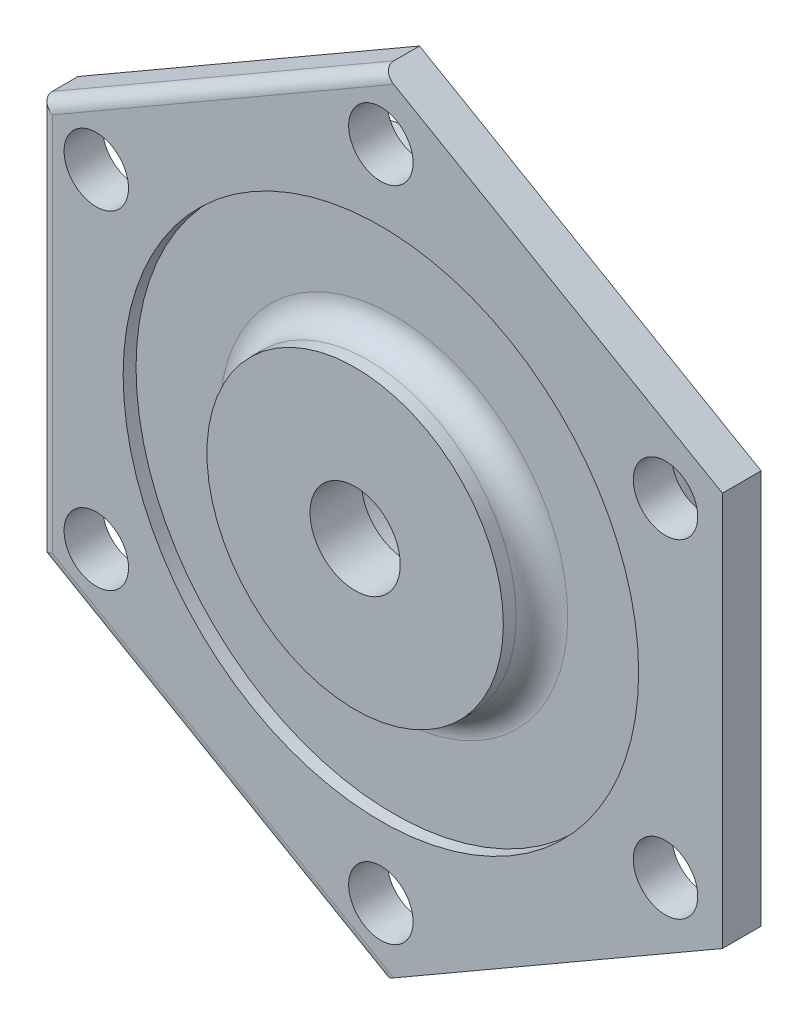
ISO-10303-21;
HEADER;
FILE_DESCRIPTION(('STEP AP214'),'2;1');
FILE_NAME('part.step','',(''),(''),'','','');
FILE_SCHEMA(('AUTOMOTIVE_DESIGN { 1 0 10303 214 1 1 1 1 }'));
ENDSEC;
DATA;
#1=APPLICATION_CONTEXT('core data for automotive mechanical design processes');
#2=APPLICATION_PROTOCOL_DEFINITION('international standard','automotive_design',2000,#1);
#3=PRODUCT_CONTEXT('',#1,'mechanical');
#4=PRODUCT('Part','Part','',(#3));
#5=PRODUCT_RELATED_PRODUCT_CATEGORY('part','',(#4));
#6=PRODUCT_DEFINITION_FORMATION('','',#4);
#7=PRODUCT_DEFINITION_CONTEXT('part definition',#1,'design');
#8=PRODUCT_DEFINITION('design','',#6,#7);
#9=PRODUCT_DEFINITION_SHAPE('','',#8);
#10=(LENGTH_UNIT() NAMED_UNIT(*) SI_UNIT(.MILLI.,.METRE.));
#11=(NAMED_UNIT(*) PLANE_ANGLE_UNIT() SI_UNIT($,.RADIAN.));
#12=(NAMED_UNIT(*) SI_UNIT($,.STERADIAN.) SOLID_ANGLE_UNIT());
#13=UNCERTAINTY_MEASURE_WITH_UNIT(LENGTH_MEASURE(1.E-05),#10,'distance_accuracy_value','');
#14=(GEOMETRIC_REPRESENTATION_CONTEXT(3) GLOBAL_UNCERTAINTY_ASSIGNED_CONTEXT((#13)) GLOBAL_UNIT_ASSIGNED_CONTEXT((#10,
#11,#12)) REPRESENTATION_CONTEXT('',''));
#15=CARTESIAN_POINT('',(0.,0.,0.));
#16=DIRECTION('',(0.,0.,1.));
#17=DIRECTION('',(1.,0.,0.));
#18=AXIS2_PLACEMENT_3D('',#15,#16,#17);
#19=CARTESIAN_POINT('',(0.,0.,-8.));
#20=DIRECTION('',(0.,0.,1.));
#21=DIRECTION('',(1.,0.,0.));
#22=AXIS2_PLACEMENT_3D('',#19,#20,#21);
#23=CYLINDRICAL_SURFACE('',#22,45.);
#24=CARTESIAN_POINT('',(0.,0.,-6.99999999999996));
#25=DIRECTION('',(0.,0.,1.));
#26=DIRECTION('',(1.,0.,0.));
#27=AXIS2_PLACEMENT_3D('',#24,#25,#26);
#28=CIRCLE('',#27,45.);
#29=CARTESIAN_POINT('',(45.,0.,-6.99999999999996));
#30=VERTEX_POINT('',#29);
#31=EDGE_CURVE('E222',#30,#30,#28,.T.);
#32=ORIENTED_EDGE('',*,*,#31,.T.);
#33=EDGE_LOOP('',(#32));
#34=FACE_BOUND('',#33,.T.);
#35=CARTESIAN_POINT('',(0.,0.,-2.));
#36=DIRECTION('',(0.,0.,1.));
#37=DIRECTION('',(1.,0.,0.));
#38=AXIS2_PLACEMENT_3D('',#35,#36,#37);
#39=CIRCLE('',#38,45.);
#40=CARTESIAN_POINT('',(45.,0.,-2.));
#41=VERTEX_POINT('',#40);
#42=EDGE_CURVE('E146',#41,#41,#39,.T.);
#43=ORIENTED_EDGE('',*,*,#42,.F.);
#44=EDGE_LOOP('',(#43));
#45=FACE_BOUND('',#44,.T.);
#46=ADVANCED_FACE('F39',(#34,#45),#23,.T.);
#47=CARTESIAN_POINT('',(0.,0.,0.));
#48=DIRECTION('',(0.,0.,1.));
#49=DIRECTION('',(1.,0.,0.));
#50=AXIS2_PLACEMENT_3D('',#47,#48,#49);
#51=PLANE('',#50);
#52=CARTESIAN_POINT('',(0.,0.,0.));
#53=DIRECTION('',(0.,0.,1.));
#54=DIRECTION('',(1.,0.,0.));
#55=AXIS2_PLACEMENT_3D('',#52,#53,#54);
#56=CIRCLE('',#55,19.);
#57=CARTESIAN_POINT('',(19.,0.,0.));
#58=VERTEX_POINT('',#57);
#59=EDGE_CURVE('E192',#58,#58,#56,.T.);
#60=ORIENTED_EDGE('',*,*,#59,.T.);
#61=EDGE_LOOP('',(#60));
#62=FACE_BOUND('',#61,.T.);
#63=CARTESIAN_POINT('',(0.,0.,0.));
#64=DIRECTION('',(0.,0.,1.));
#65=DIRECTION('',(1.,0.,0.));
#66=AXIS2_PLACEMENT_3D('',#63,#64,#65);
#67=CIRCLE('',#66,23.);
#68=CARTESIAN_POINT('',(23.,0.,0.));
#69=VERTEX_POINT('',#68);
#70=EDGE_CURVE('E203',#69,#69,#67,.T.);
#71=ORIENTED_EDGE('',*,*,#70,.F.);
#72=EDGE_LOOP('',(#71));
#73=FACE_BOUND('',#72,.T.);
#74=ADVANCED_FACE('F290',(#62,#73),#51,.F.);
#75=CARTESIAN_POINT('',(0.,0.,0.));
#76=DIRECTION('',(0.,0.,1.));
#77=DIRECTION('',(1.,0.,0.));
#78=AXIS2_PLACEMENT_3D('',#75,#76,#77);
#79=CIRCLE('',#78,7.);
#80=CARTESIAN_POINT('',(7.,0.,0.));
#81=VERTEX_POINT('',#80);
#82=EDGE_CURVE('E209',#81,#81,#79,.T.);
#83=ORIENTED_EDGE('',*,*,#82,.T.);
#84=EDGE_LOOP('',(#83));
#85=FACE_BOUND('',#84,.T.);
#86=CARTESIAN_POINT('',(0.,0.,0.));
#87=DIRECTION('',(0.,0.,1.));
#88=DIRECTION('',(1.,0.,0.));
#89=AXIS2_PLACEMENT_3D('',#86,#87,#88);
#90=CIRCLE('',#89,14.);
#91=CARTESIAN_POINT('',(14.,0.,0.));
#92=VERTEX_POINT('',#91);
#93=EDGE_CURVE('E200',#92,#92,#90,.T.);
#94=ORIENTED_EDGE('',*,*,#93,.F.);
#95=EDGE_LOOP('',(#94));
#96=FACE_BOUND('',#95,.T.);
#97=ADVANCED_FACE('F296',(#85,#96),#51,.F.);
#98=CARTESIAN_POINT('',(0.,0.,8.));
#99=DIRECTION('',(0.,0.,-1.));
#100=DIRECTION('',(-1.,0.,0.));
#101=AXIS2_PLACEMENT_3D('',#98,#99,#100);
#102=CYLINDRICAL_SURFACE('',#101,7.);
#103=CARTESIAN_POINT('',(0.,0.,8.));
#104=DIRECTION('',(0.,0.,1.));
#105=DIRECTION('',(1.,0.,0.));
#106=AXIS2_PLACEMENT_3D('',#103,#104,#105);
#107=CIRCLE('',#106,7.);
#108=CARTESIAN_POINT('',(7.,0.,8.));
#109=VERTEX_POINT('',#108);
#110=EDGE_CURVE('E204',#109,#109,#107,.T.);
#111=ORIENTED_EDGE('',*,*,#110,.T.);
#112=EDGE_LOOP('',(#111));
#113=FACE_BOUND('',#112,.T.);
#114=ORIENTED_EDGE('',*,*,#82,.F.);
#115=EDGE_LOOP('',(#114));
#116=FACE_BOUND('',#115,.T.);
#117=ADVANCED_FACE('F336',(#113,#116),#102,.F.);
#118=CARTESIAN_POINT('',(0.,0.,8.));
#119=DIRECTION('',(0.,0.,1.));
#120=DIRECTION('',(1.,0.,0.));
#121=AXIS2_PLACEMENT_3D('',#118,#119,#120);
#122=PLANE('',#121);
#123=ORIENTED_EDGE('',*,*,#110,.F.);
#124=EDGE_LOOP('',(#123));
#125=FACE_BOUND('',#124,.T.);
#126=CARTESIAN_POINT('',(0.,0.,8.));
#127=DIRECTION('',(0.,0.,1.));
#128=DIRECTION('',(1.,0.,0.));
#129=AXIS2_PLACEMENT_3D('',#126,#127,#128);
#130=CIRCLE('',#129,23.);
#131=CARTESIAN_POINT('',(23.,0.,8.));
#132=VERTEX_POINT('',#131);
#133=EDGE_CURVE('E199',#132,#132,#130,.T.);
#134=ORIENTED_EDGE('',*,*,#133,.T.);
#135=EDGE_LOOP('',(#134));
#136=FACE_BOUND('',#135,.T.);
#137=ADVANCED_FACE('F333',(#125,#136),#122,.T.);
#138=CARTESIAN_POINT('',(0.,0.,8.));
#139=DIRECTION('',(0.,0.,-1.));
#140=DIRECTION('',(-1.,0.,0.));
#141=AXIS2_PLACEMENT_3D('',#138,#139,#140);
#142=CYLINDRICAL_SURFACE('',#141,23.);
#143=CARTESIAN_POINT('',(0.,0.,6.));
#144=DIRECTION('',(0.,0.,1.));
#145=DIRECTION('',(1.,0.,0.));
#146=AXIS2_PLACEMENT_3D('',#143,#144,#145);
#147=CIRCLE('',#146,23.);
#148=CARTESIAN_POINT('',(23.,0.,6.));
#149=VERTEX_POINT('',#148);
#150=EDGE_CURVE('E216',#149,#149,#147,.T.);
#151=ORIENTED_EDGE('',*,*,#150,.T.);
#152=EDGE_LOOP('',(#151));
#153=FACE_BOUND('',#152,.T.);
#154=ORIENTED_EDGE('',*,*,#133,.F.);
#155=EDGE_LOOP('',(#154));
#156=FACE_BOUND('',#155,.T.);
#157=ADVANCED_FACE('F329',(#153,#156),#142,.T.);
#158=CARTESIAN_POINT('',(0.,0.,-8.));
#159=DIRECTION('',(0.,0.,1.));
#160=DIRECTION('',(1.,0.,0.));
#161=AXIS2_PLACEMENT_3D('',#158,#159,#160);
#162=CYLINDRICAL_SURFACE('',#161,14.);
#163=CARTESIAN_POINT('',(0.,0.,-8.));
#164=DIRECTION('',(0.,0.,1.));
#165=DIRECTION('',(1.,0.,0.));
#166=AXIS2_PLACEMENT_3D('',#163,#164,#165);
#167=CIRCLE('',#166,14.);
#168=CARTESIAN_POINT('',(14.,0.,-8.));
#169=VERTEX_POINT('',#168);
#170=EDGE_CURVE('E193',#169,#169,#167,.T.);
#171=ORIENTED_EDGE('',*,*,#170,.F.);
#172=EDGE_LOOP('',(#171));
#173=FACE_BOUND('',#172,.T.);
#174=ORIENTED_EDGE('',*,*,#93,.T.);
#175=EDGE_LOOP('',(#174));
#176=FACE_BOUND('',#175,.T.);
#177=ADVANCED_FACE('F325',(#173,#176),#162,.F.);
#178=CARTESIAN_POINT('',(0.,0.,-8.));
#179=DIRECTION('',(0.,0.,1.));
#180=DIRECTION('',(1.,0.,0.));
#181=AXIS2_PLACEMENT_3D('',#178,#179,#180);
#182=CYLINDRICAL_SURFACE('',#181,19.);
#183=CARTESIAN_POINT('',(0.,0.,-8.));
#184=DIRECTION('',(0.,0.,1.));
#185=DIRECTION('',(1.,0.,0.));
#186=AXIS2_PLACEMENT_3D('',#183,#184,#185);
#187=CIRCLE('',#186,19.);
#188=CARTESIAN_POINT('',(19.,0.,-8.));
#189=VERTEX_POINT('',#188);
#190=EDGE_CURVE('E196',#189,#189,#187,.T.);
#191=ORIENTED_EDGE('',*,*,#190,.T.);
#192=EDGE_LOOP('',(#191));
#193=FACE_BOUND('',#192,.T.);
#194=ORIENTED_EDGE('',*,*,#59,.F.);
#195=EDGE_LOOP('',(#194));
#196=FACE_BOUND('',#195,.T.);
#197=ADVANCED_FACE('F321',(#193,#196),#182,.T.);
#198=CARTESIAN_POINT('',(0.,0.,-8.));
#199=DIRECTION('',(0.,0.,1.));
#200=DIRECTION('',(1.,0.,0.));
#201=AXIS2_PLACEMENT_3D('',#198,#199,#200);
#202=PLANE('',#201);
#203=ORIENTED_EDGE('',*,*,#170,.T.);
#204=EDGE_LOOP('',(#203));
#205=FACE_BOUND('',#204,.T.);
#206=ORIENTED_EDGE('',*,*,#190,.F.);
#207=EDGE_LOOP('',(#206));
#208=FACE_BOUND('',#207,.T.);
#209=ADVANCED_FACE('F317',(#205,#208),#202,.F.);
#210=CARTESIAN_POINT('',(0.,0.,2.));
#211=DIRECTION('',(0.,0.,1.));
#212=DIRECTION('',(1.,0.,0.));
#213=AXIS2_PLACEMENT_3D('',#210,#211,#212);
#214=PLANE('',#213);
#215=CARTESIAN_POINT('',(0.,0.,2.));
#216=DIRECTION('',(0.,0.,1.));
#217=DIRECTION('',(1.,0.,0.));
#218=AXIS2_PLACEMENT_3D('',#215,#216,#217);
#219=CIRCLE('',#218,27.);
#220=CARTESIAN_POINT('',(27.,0.,2.));
#221=VERTEX_POINT('',#220);
#222=EDGE_CURVE('E219',#221,#221,#219,.F.);
#223=ORIENTED_EDGE('',*,*,#222,.T.);
#224=EDGE_LOOP('',(#223));
#225=FACE_BOUND('',#224,.T.);
#226=CARTESIAN_POINT('',(0.,0.,2.));
#227=DIRECTION('',(0.,0.,1.));
#228=DIRECTION('',(1.,0.,0.));
#229=AXIS2_PLACEMENT_3D('',#226,#227,#228);
#230=CIRCLE('',#229,40.);
#231=CARTESIAN_POINT('',(40.,0.,2.));
#232=VERTEX_POINT('',#231);
#233=EDGE_CURVE('E180',#232,#232,#230,.F.);
#234=ORIENTED_EDGE('',*,*,#233,.F.);
#235=EDGE_LOOP('',(#234));
#236=FACE_BOUND('',#235,.T.);
#237=ADVANCED_FACE('F313',(#225,#236),#214,.T.);
#238=CARTESIAN_POINT('',(0.,0.,-4.));
#239=DIRECTION('',(0.,0.,1.));
#240=DIRECTION('',(1.,0.,0.));
#241=AXIS2_PLACEMENT_3D('',#238,#239,#240);
#242=CYLINDRICAL_SURFACE('',#241,23.);
#243=CARTESIAN_POINT('',(0.,0.,-4.));
#244=DIRECTION('',(0.,0.,1.));
#245=DIRECTION('',(1.,0.,0.));
#246=AXIS2_PLACEMENT_3D('',#243,#244,#245);
#247=CIRCLE('',#246,23.);
#248=CARTESIAN_POINT('',(23.,0.,-4.));
#249=VERTEX_POINT('',#248);
#250=EDGE_CURVE('E186',#249,#249,#247,.T.);
#251=ORIENTED_EDGE('',*,*,#250,.F.);
#252=EDGE_LOOP('',(#251));
#253=FACE_BOUND('',#252,.T.);
#254=ORIENTED_EDGE('',*,*,#70,.T.);
#255=EDGE_LOOP('',(#254));
#256=FACE_BOUND('',#255,.T.);
#257=ADVANCED_FACE('F309',(#253,#256),#242,.F.);
#258=CARTESIAN_POINT('',(0.,0.,-4.));
#259=DIRECTION('',(0.,0.,1.));
#260=DIRECTION('',(1.,0.,0.));
#261=AXIS2_PLACEMENT_3D('',#258,#259,#260);
#262=PLANE('',#261);
#263=ORIENTED_EDGE('',*,*,#250,.T.);
#264=EDGE_LOOP('',(#263));
#265=FACE_BOUND('',#264,.T.);
#266=CARTESIAN_POINT('',(0.,0.,-4.));
#267=DIRECTION('',(0.,0.,1.));
#268=DIRECTION('',(1.,0.,0.));
#269=AXIS2_PLACEMENT_3D('',#266,#267,#268);
#270=CIRCLE('',#269,40.);
#271=CARTESIAN_POINT('',(40.,0.,-4.));
#272=VERTEX_POINT('',#271);
#273=EDGE_CURVE('E189',#272,#272,#270,.T.);
#274=ORIENTED_EDGE('',*,*,#273,.F.);
#275=EDGE_LOOP('',(#274));
#276=FACE_BOUND('',#275,.T.);
#277=ADVANCED_FACE('F305',(#265,#276),#262,.F.);
#278=CARTESIAN_POINT('',(0.,0.,-8.));
#279=DIRECTION('',(0.,0.,1.));
#280=DIRECTION('',(1.,0.,0.));
#281=AXIS2_PLACEMENT_3D('',#278,#279,#280);
#282=CYLINDRICAL_SURFACE('',#281,40.);
#283=CARTESIAN_POINT('',(0.,0.,-8.));
#284=DIRECTION('',(0.,0.,1.));
#285=DIRECTION('',(1.,0.,0.));
#286=AXIS2_PLACEMENT_3D('',#283,#284,#285);
#287=CIRCLE('',#286,40.);
#288=CARTESIAN_POINT('',(40.,0.,-8.));
#289=VERTEX_POINT('',#288);
#290=EDGE_CURVE('E183',#289,#289,#287,.T.);
#291=ORIENTED_EDGE('',*,*,#290,.F.);
#292=EDGE_LOOP('',(#291));
#293=FACE_BOUND('',#292,.T.);
#294=ORIENTED_EDGE('',*,*,#273,.T.);
#295=EDGE_LOOP('',(#294));
#296=FACE_BOUND('',#295,.T.);
#297=ADVANCED_FACE('F302',(#293,#296),#282,.F.);
#298=CARTESIAN_POINT('',(0.,0.,-8.));
#299=DIRECTION('',(0.,0.,1.));
#300=DIRECTION('',(1.,0.,0.));
#301=AXIS2_PLACEMENT_3D('',#298,#299,#300);
#302=PLANE('',#301);
#303=CARTESIAN_POINT('',(0.,0.,-8.));
#304=DIRECTION('',(0.,0.,1.));
#305=DIRECTION('',(1.,0.,0.));
#306=AXIS2_PLACEMENT_3D('',#303,#304,#305);
#307=CIRCLE('',#306,44.);
#308=CARTESIAN_POINT('',(44.,0.,-8.));
#309=VERTEX_POINT('',#308);
#310=EDGE_CURVE('E225',#309,#309,#307,.F.);
#311=ORIENTED_EDGE('',*,*,#310,.T.);
#312=EDGE_LOOP('',(#311));
#313=FACE_BOUND('',#312,.T.);
#314=ORIENTED_EDGE('',*,*,#290,.T.);
#315=EDGE_LOOP('',(#314));
#316=FACE_BOUND('',#315,.T.);
#317=ADVANCED_FACE('F283',(#313,#316),#302,.F.);
#318=CARTESIAN_POINT('',(0.,0.,4.));
#319=DIRECTION('',(0.,0.,-1.));
#320=DIRECTION('',(-1.,0.,0.));
#321=AXIS2_PLACEMENT_3D('',#318,#319,#320);
#322=CYLINDRICAL_SURFACE('',#321,40.);
#323=ORIENTED_EDGE('',*,*,#233,.T.);
#324=EDGE_LOOP('',(#323));
#325=FACE_BOUND('',#324,.T.);
#326=CARTESIAN_POINT('',(0.,0.,4.));
#327=DIRECTION('',(0.,0.,1.));
#328=DIRECTION('',(1.,0.,0.));
#329=AXIS2_PLACEMENT_3D('',#326,#327,#328);
#330=CIRCLE('',#329,40.);
#331=CARTESIAN_POINT('',(40.,0.,4.));
#332=VERTEX_POINT('',#331);
#333=EDGE_CURVE('E169',#332,#332,#330,.T.);
#334=ORIENTED_EDGE('',*,*,#333,.T.);
#335=EDGE_LOOP('',(#334));
#336=FACE_BOUND('',#335,.T.);
#337=ADVANCED_FACE('F274',(#325,#336),#322,.F.);
#338=CARTESIAN_POINT('',(0.,0.,4.));
#339=DIRECTION('',(0.,0.,1.));
#340=DIRECTION('',(1.,0.,0.));
#341=AXIS2_PLACEMENT_3D('',#338,#339,#340);
#342=PLANE('',#341);
#343=ORIENTED_EDGE('',*,*,#333,.F.);
#344=EDGE_LOOP('',(#343));
#345=FACE_BOUND('',#344,.T.);
#346=CARTESIAN_POINT('',(-44.1672955930064,25.5,4.));
#347=DIRECTION('',(0.,0.,1.));
#348=DIRECTION('',(1.,0.,0.));
#349=AXIS2_PLACEMENT_3D('',#346,#347,#348);
#350=CIRCLE('',#349,5.0000000000006);
#351=CARTESIAN_POINT('',(-39.1672955930058,25.5,4.));
#352=VERTEX_POINT('',#351);
#353=EDGE_CURVE('E247',#352,#352,#350,.T.);
#354=ORIENTED_EDGE('',*,*,#353,.F.);
#355=EDGE_LOOP('',(#354));
#356=FACE_BOUND('',#355,.T.);
#357=CARTESIAN_POINT('',(-44.1672955930064,-25.5,4.));
#358=DIRECTION('',(0.,0.,1.));
#359=DIRECTION('',(1.,0.,0.));
#360=AXIS2_PLACEMENT_3D('',#357,#358,#359);
#361=CIRCLE('',#360,5.00000000000047);
#362=CARTESIAN_POINT('',(-39.1672955930059,-25.5,4.));
#363=VERTEX_POINT('',#362);
#364=EDGE_CURVE('E252',#363,#363,#361,.T.);
#365=ORIENTED_EDGE('',*,*,#364,.F.);
#366=EDGE_LOOP('',(#365));
#367=FACE_BOUND('',#366,.T.);
#368=CARTESIAN_POINT('',(0.,-51.,4.));
#369=DIRECTION('',(0.,0.,1.));
#370=DIRECTION('',(1.,0.,0.));
#371=AXIS2_PLACEMENT_3D('',#368,#369,#370);
#372=CIRCLE('',#371,5.00000000000034);
#373=CARTESIAN_POINT('',(5.00000000000034,-51.,4.));
#374=VERTEX_POINT('',#373);
#375=EDGE_CURVE('E257',#374,#374,#372,.T.);
#376=ORIENTED_EDGE('',*,*,#375,.F.);
#377=EDGE_LOOP('',(#376));
#378=FACE_BOUND('',#377,.T.);
#379=CARTESIAN_POINT('',(44.1672955930064,-25.5,4.));
#380=DIRECTION('',(0.,0.,1.));
#381=DIRECTION('',(1.,0.,0.));
#382=AXIS2_PLACEMENT_3D('',#379,#380,#381);
#383=CIRCLE('',#382,5.00000000000023);
#384=CARTESIAN_POINT('',(49.1672955930066,-25.5,4.));
#385=VERTEX_POINT('',#384);
#386=EDGE_CURVE('E262',#385,#385,#383,.T.);
#387=ORIENTED_EDGE('',*,*,#386,.F.);
#388=EDGE_LOOP('',(#387));
#389=FACE_BOUND('',#388,.T.);
#390=CARTESIAN_POINT('',(44.1672955930064,25.5,4.));
#391=DIRECTION('',(0.,0.,1.));
#392=DIRECTION('',(1.,0.,0.));
#393=AXIS2_PLACEMENT_3D('',#390,#391,#392);
#394=CIRCLE('',#393,5.00000000000013);
#395=CARTESIAN_POINT('',(49.1672955930065,25.5,4.));
#396=VERTEX_POINT('',#395);
#397=EDGE_CURVE('E265',#396,#396,#394,.T.);
#398=ORIENTED_EDGE('',*,*,#397,.F.);
#399=EDGE_LOOP('',(#398));
#400=FACE_BOUND('',#399,.T.);
#401=CARTESIAN_POINT('',(0.,51.,4.));
#402=DIRECTION('',(0.,0.,1.));
#403=DIRECTION('',(1.,0.,0.));
#404=AXIS2_PLACEMENT_3D('',#401,#402,#403);
#405=CIRCLE('',#404,5.);
#406=CARTESIAN_POINT('',(5.,51.,4.));
#407=VERTEX_POINT('',#406);
#408=EDGE_CURVE('E112',#407,#407,#405,.T.);
#409=ORIENTED_EDGE('',*,*,#408,.F.);
#410=EDGE_LOOP('',(#409));
#411=FACE_BOUND('',#410,.T.);
#412=DIRECTION('',(-0.866025403784439,0.5,0.));
#413=VECTOR('',#412,1.);
#414=CARTESIAN_POINT('',(26.5,45.8993464005753,4.));
#415=LINE('',#414,#413);
#416=CARTESIAN_POINT('',(53.,30.5995642670502,4.));
#417=VERTEX_POINT('',#416);
#418=CARTESIAN_POINT('',(2.00000000000002,60.0444279957211,4.));
#419=VERTEX_POINT('',#418);
#420=EDGE_CURVE('E126',#417,#419,#415,.T.);
#421=ORIENTED_EDGE('',*,*,#420,.T.);
#422=DIRECTION('',(-0.866025403784439,-0.5,0.));
#423=VECTOR('',#422,1.);
#424=CARTESIAN_POINT('',(-25.5,44.1672955930064,4.));
#425=LINE('',#424,#423);
#426=CARTESIAN_POINT('',(-51.,29.4448637286709,4.));
#427=VERTEX_POINT('',#426);
#428=EDGE_CURVE('E231',#419,#427,#425,.T.);
#429=ORIENTED_EDGE('',*,*,#428,.T.);
#430=DIRECTION('',(0.,-1.,0.));
#431=VECTOR('',#430,1.);
#432=CARTESIAN_POINT('',(-51.,0.,4.));
#433=LINE('',#432,#431);
#434=CARTESIAN_POINT('',(-51.,-29.4448637286709,4.));
#435=VERTEX_POINT('',#434);
#436=EDGE_CURVE('E229',#427,#435,#433,.T.);
#437=ORIENTED_EDGE('',*,*,#436,.T.);
#438=DIRECTION('',(0.866025403784439,-0.5,0.));
#439=VECTOR('',#438,1.);
#440=CARTESIAN_POINT('',(-25.5,-44.1672955930064,4.));
#441=LINE('',#440,#439);
#442=CARTESIAN_POINT('',(2.,-60.0444279957211,4.));
#443=VERTEX_POINT('',#442);
#444=EDGE_CURVE('E111',#435,#443,#441,.T.);
#445=ORIENTED_EDGE('',*,*,#444,.T.);
#446=DIRECTION('',(0.866025403784438,0.5,0.));
#447=VECTOR('',#446,1.);
#448=CARTESIAN_POINT('',(26.5,-45.8993464005752,4.));
#449=LINE('',#448,#447);
#450=CARTESIAN_POINT('',(53.,-30.5995642670501,4.));
#451=VERTEX_POINT('',#450);
#452=EDGE_CURVE('E103',#443,#451,#449,.T.);
#453=ORIENTED_EDGE('',*,*,#452,.T.);
#454=DIRECTION('',(0.,1.,0.));
#455=VECTOR('',#454,1.);
#456=CARTESIAN_POINT('',(53.,0.,4.));
#457=LINE('',#456,#455);
#458=EDGE_CURVE('E108',#451,#417,#457,.T.);
#459=ORIENTED_EDGE('',*,*,#458,.T.);
#460=EDGE_LOOP('',(#421,#429,#437,#445,#453,#459));
#461=FACE_BOUND('',#460,.T.);
#462=ADVANCED_FACE('F106',(#345,#356,#367,#378,#389,#400,#411,#461),#342,.T.);
#463=CARTESIAN_POINT('',(-26.5,-45.8993464005753,-2.));
#464=DIRECTION('',(-0.5,-0.866025403784439,0.));
#465=DIRECTION('',(0.866025403784439,-0.5,0.));
#466=AXIS2_PLACEMENT_3D('',#463,#464,#465);
#467=PLANE('',#466);
#468=DIRECTION('',(0.,0.,1.));
#469=VECTOR('',#468,1.);
#470=CARTESIAN_POINT('',(0.,-61.1991285341003,-2.));
#471=LINE('',#470,#469);
#472=CARTESIAN_POINT('',(0.,-61.1991285341003,-2.));
#473=VERTEX_POINT('',#472);
#474=CARTESIAN_POINT('',(0.,-61.1991285341003,2.));
#475=VERTEX_POINT('',#474);
#476=EDGE_CURVE('E123',#473,#475,#471,.T.);
#477=ORIENTED_EDGE('',*,*,#476,.T.);
#478=DIRECTION('',(0.866025403784439,-0.5,0.));
#479=VECTOR('',#478,1.);
#480=CARTESIAN_POINT('',(-26.5,-45.8993464005753,2.));
#481=LINE('',#480,#479);
#482=CARTESIAN_POINT('',(-53.,-30.5995642670502,2.));
#483=VERTEX_POINT('',#482);
#484=EDGE_CURVE('E11',#475,#483,#481,.F.);
#485=ORIENTED_EDGE('',*,*,#484,.T.);
#486=DIRECTION('',(0.,0.,1.));
#487=VECTOR('',#486,1.);
#488=CARTESIAN_POINT('',(-53.,-30.5995642670502,-2.));
#489=LINE('',#488,#487);
#490=CARTESIAN_POINT('',(-53.,-30.5995642670502,-2.));
#491=VERTEX_POINT('',#490);
#492=EDGE_CURVE('E167',#491,#483,#489,.T.);
#493=ORIENTED_EDGE('',*,*,#492,.F.);
#494=DIRECTION('',(0.866025403784439,-0.5,0.));
#495=VECTOR('',#494,1.);
#496=CARTESIAN_POINT('',(-26.5,-45.8993464005753,-2.));
#497=LINE('',#496,#495);
#498=EDGE_CURVE('E152',#491,#473,#497,.T.);
#499=ORIENTED_EDGE('',*,*,#498,.T.);
#500=EDGE_LOOP('',(#477,#485,#493,#499));
#501=FACE_BOUND('',#500,.T.);
#502=ADVANCED_FACE('F273',(#501),#467,.T.);
#503=CARTESIAN_POINT('',(-53.,0.,-2.));
#504=DIRECTION('',(-1.,0.,0.));
#505=DIRECTION('',(0.,0.,1.));
#506=AXIS2_PLACEMENT_3D('',#503,#504,#505);
#507=PLANE('',#506);
#508=ORIENTED_EDGE('',*,*,#492,.T.);
#509=DIRECTION('',(0.,-1.,0.));
#510=VECTOR('',#509,1.);
#511=CARTESIAN_POINT('',(-53.,0.,2.));
#512=LINE('',#511,#510);
#513=CARTESIAN_POINT('',(-53.,30.5995642670502,2.));
#514=VERTEX_POINT('',#513);
#515=EDGE_CURVE('E238',#483,#514,#512,.F.);
#516=ORIENTED_EDGE('',*,*,#515,.T.);
#517=DIRECTION('',(0.,0.,1.));
#518=VECTOR('',#517,1.);
#519=CARTESIAN_POINT('',(-53.,30.5995642670502,-2.));
#520=LINE('',#519,#518);
#521=CARTESIAN_POINT('',(-53.,30.5995642670502,-2.));
#522=VERTEX_POINT('',#521);
#523=EDGE_CURVE('E170',#522,#514,#520,.T.);
#524=ORIENTED_EDGE('',*,*,#523,.F.);
#525=DIRECTION('',(0.,-1.,0.));
#526=VECTOR('',#525,1.);
#527=CARTESIAN_POINT('',(-53.,0.,-2.));
#528=LINE('',#527,#526);
#529=EDGE_CURVE('E164',#522,#491,#528,.T.);
#530=ORIENTED_EDGE('',*,*,#529,.T.);
#531=EDGE_LOOP('',(#508,#516,#524,#530));
#532=FACE_BOUND('',#531,.T.);
#533=ADVANCED_FACE('F281',(#532),#507,.T.);
#534=CARTESIAN_POINT('',(-26.5,45.8993464005752,-2.));
#535=DIRECTION('',(-0.5,0.866025403784439,0.));
#536=DIRECTION('',(-0.866025403784439,-0.5,0.));
#537=AXIS2_PLACEMENT_3D('',#534,#535,#536);
#538=PLANE('',#537);
#539=ORIENTED_EDGE('',*,*,#523,.T.);
#540=DIRECTION('',(-0.866025403784439,-0.5,0.));
#541=VECTOR('',#540,1.);
#542=CARTESIAN_POINT('',(-26.5,45.8993464005752,2.));
#543=LINE('',#542,#541);
#544=CARTESIAN_POINT('',(0.,61.1991285341003,2.));
#545=VERTEX_POINT('',#544);
#546=EDGE_CURVE('E234',#514,#545,#543,.F.);
#547=ORIENTED_EDGE('',*,*,#546,.T.);
#548=DIRECTION('',(0.,0.,1.));
#549=VECTOR('',#548,1.);
#550=CARTESIAN_POINT('',(0.,61.1991285341003,-2.));
#551=LINE('',#550,#549);
#552=CARTESIAN_POINT('',(0.,61.1991285341003,-2.));
#553=VERTEX_POINT('',#552);
#554=EDGE_CURVE('E173',#553,#545,#551,.T.);
#555=ORIENTED_EDGE('',*,*,#554,.F.);
#556=DIRECTION('',(-0.866025403784439,-0.5,0.));
#557=VECTOR('',#556,1.);
#558=CARTESIAN_POINT('',(-26.5,45.8993464005752,-2.));
#559=LINE('',#558,#557);
#560=EDGE_CURVE('E161',#553,#522,#559,.T.);
#561=ORIENTED_EDGE('',*,*,#560,.T.);
#562=EDGE_LOOP('',(#539,#547,#555,#561));
#563=FACE_BOUND('',#562,.T.);
#564=ADVANCED_FACE('F366',(#563),#538,.T.);
#565=CARTESIAN_POINT('',(26.5,45.8993464005753,-2.));
#566=DIRECTION('',(0.5,0.866025403784439,0.));
#567=DIRECTION('',(-0.866025403784439,0.5,0.));
#568=AXIS2_PLACEMENT_3D('',#565,#566,#567);
#569=PLANE('',#568);
#570=ORIENTED_EDGE('',*,*,#554,.T.);
#571=CARTESIAN_POINT('',(2.00000000000002,60.0444279957211,2.));
#572=DIRECTION('',(0.5,0.866025403784439,0.));
#573=DIRECTION('',(-0.866025403784439,0.5,0.));
#574=AXIS2_PLACEMENT_3D('',#571,#572,#573);
#575=ELLIPSE('',#574,2.3094010767585,2.);
#576=EDGE_CURVE('E236',#545,#419,#575,.T.);
#577=ORIENTED_EDGE('',*,*,#576,.T.);
#578=ORIENTED_EDGE('',*,*,#420,.F.);
#579=DIRECTION('',(0.,0.,1.));
#580=VECTOR('',#579,1.);
#581=CARTESIAN_POINT('',(53.,30.5995642670502,-2.));
#582=LINE('',#581,#580);
#583=CARTESIAN_POINT('',(53.,30.5995642670502,-2.));
#584=VERTEX_POINT('',#583);
#585=EDGE_CURVE('E122',#584,#417,#582,.T.);
#586=ORIENTED_EDGE('',*,*,#585,.F.);
#587=DIRECTION('',(-0.866025403784439,0.5,0.));
#588=VECTOR('',#587,1.);
#589=CARTESIAN_POINT('',(26.5,45.8993464005753,-2.));
#590=LINE('',#589,#588);
#591=EDGE_CURVE('E158',#584,#553,#590,.T.);
#592=ORIENTED_EDGE('',*,*,#591,.T.);
#593=EDGE_LOOP('',(#570,#577,#578,#586,#592));
#594=FACE_BOUND('',#593,.T.);
#595=ADVANCED_FACE('F371',(#594),#569,.T.);
#596=CARTESIAN_POINT('',(53.,0.,-2.));
#597=DIRECTION('',(1.,0.,0.));
#598=DIRECTION('',(0.,1.,0.));
#599=AXIS2_PLACEMENT_3D('',#596,#597,#598);
#600=PLANE('',#599);
#601=ORIENTED_EDGE('',*,*,#585,.T.);
#602=ORIENTED_EDGE('',*,*,#458,.F.);
#603=DIRECTION('',(0.,0.,1.));
#604=VECTOR('',#603,1.);
#605=CARTESIAN_POINT('',(53.,-30.5995642670501,-2.));
#606=LINE('',#605,#604);
#607=CARTESIAN_POINT('',(53.,-30.5995642670501,-2.));
#608=VERTEX_POINT('',#607);
#609=EDGE_CURVE('E115',#608,#451,#606,.T.);
#610=ORIENTED_EDGE('',*,*,#609,.F.);
#611=DIRECTION('',(0.,1.,0.));
#612=VECTOR('',#611,1.);
#613=CARTESIAN_POINT('',(53.,0.,-2.));
#614=LINE('',#613,#612);
#615=EDGE_CURVE('E156',#608,#584,#614,.T.);
#616=ORIENTED_EDGE('',*,*,#615,.T.);
#617=EDGE_LOOP('',(#601,#602,#610,#616));
#618=FACE_BOUND('',#617,.T.);
#619=ADVANCED_FACE('F125',(#618),#600,.T.);
#620=CARTESIAN_POINT('',(0.,51.,-2.));
#621=DIRECTION('',(0.,0.,1.));
#622=DIRECTION('',(1.,0.,0.));
#623=AXIS2_PLACEMENT_3D('',#620,#621,#622);
#624=CYLINDRICAL_SURFACE('',#623,5.);
#625=CARTESIAN_POINT('',(0.,51.,-2.));
#626=DIRECTION('',(0.,0.,1.));
#627=DIRECTION('',(1.,0.,0.));
#628=AXIS2_PLACEMENT_3D('',#625,#626,#627);
#629=CIRCLE('',#628,5.);
#630=CARTESIAN_POINT('',(5.,51.,-2.));
#631=VERTEX_POINT('',#630);
#632=EDGE_CURVE('E149',#631,#631,#629,.T.);
#633=ORIENTED_EDGE('',*,*,#632,.F.);
#634=EDGE_LOOP('',(#633));
#635=FACE_BOUND('',#634,.T.);
#636=ORIENTED_EDGE('',*,*,#408,.T.);
#637=EDGE_LOOP('',(#636));
#638=FACE_BOUND('',#637,.T.);
#639=ADVANCED_FACE('F270',(#635,#638),#624,.F.);
#640=CARTESIAN_POINT('',(44.1672955930064,25.5,-2.));
#641=DIRECTION('',(0.,0.,1.));
#642=DIRECTION('',(1.,0.,0.));
#643=AXIS2_PLACEMENT_3D('',#640,#641,#642);
#644=CYLINDRICAL_SURFACE('',#643,5.00000000000013);
#645=CARTESIAN_POINT('',(44.1672955930064,25.5,-2.));
#646=DIRECTION('',(0.,0.,1.));
#647=DIRECTION('',(1.,0.,0.));
#648=AXIS2_PLACEMENT_3D('',#645,#646,#647);
#649=CIRCLE('',#648,5.00000000000013);
#650=CARTESIAN_POINT('',(49.1672955930065,25.5,-2.));
#651=VERTEX_POINT('',#650);
#652=EDGE_CURVE('E143',#651,#651,#649,.T.);
#653=ORIENTED_EDGE('',*,*,#652,.F.);
#654=EDGE_LOOP('',(#653));
#655=FACE_BOUND('',#654,.T.);
#656=ORIENTED_EDGE('',*,*,#397,.T.);
#657=EDGE_LOOP('',(#656));
#658=FACE_BOUND('',#657,.T.);
#659=ADVANCED_FACE('F395',(#655,#658),#644,.F.);
#660=CARTESIAN_POINT('',(44.1672955930064,-25.5,-2.));
#661=DIRECTION('',(0.,0.,1.));
#662=DIRECTION('',(1.,0.,0.));
#663=AXIS2_PLACEMENT_3D('',#660,#661,#662);
#664=CYLINDRICAL_SURFACE('',#663,5.00000000000023);
#665=CARTESIAN_POINT('',(44.1672955930064,-25.5,-2.));
#666=DIRECTION('',(0.,0.,1.));
#667=DIRECTION('',(1.,0.,0.));
#668=AXIS2_PLACEMENT_3D('',#665,#666,#667);
#669=CIRCLE('',#668,5.00000000000023);
#670=CARTESIAN_POINT('',(49.1672955930066,-25.5,-2.));
#671=VERTEX_POINT('',#670);
#672=EDGE_CURVE('E140',#671,#671,#669,.T.);
#673=ORIENTED_EDGE('',*,*,#672,.F.);
#674=EDGE_LOOP('',(#673));
#675=FACE_BOUND('',#674,.T.);
#676=ORIENTED_EDGE('',*,*,#386,.T.);
#677=EDGE_LOOP('',(#676));
#678=FACE_BOUND('',#677,.T.);
#679=ADVANCED_FACE('F399',(#675,#678),#664,.F.);
#680=CARTESIAN_POINT('',(0.,-51.,-2.));
#681=DIRECTION('',(0.,0.,1.));
#682=DIRECTION('',(1.,0.,0.));
#683=AXIS2_PLACEMENT_3D('',#680,#681,#682);
#684=CYLINDRICAL_SURFACE('',#683,5.00000000000034);
#685=CARTESIAN_POINT('',(0.,-51.,-2.));
#686=DIRECTION('',(0.,0.,1.));
#687=DIRECTION('',(1.,0.,0.));
#688=AXIS2_PLACEMENT_3D('',#685,#686,#687);
#689=CIRCLE('',#688,5.00000000000034);
#690=CARTESIAN_POINT('',(5.00000000000034,-51.,-2.));
#691=VERTEX_POINT('',#690);
#692=EDGE_CURVE('E137',#691,#691,#689,.T.);
#693=ORIENTED_EDGE('',*,*,#692,.F.);
#694=EDGE_LOOP('',(#693));
#695=FACE_BOUND('',#694,.T.);
#696=ORIENTED_EDGE('',*,*,#375,.T.);
#697=EDGE_LOOP('',(#696));
#698=FACE_BOUND('',#697,.T.);
#699=ADVANCED_FACE('F403',(#695,#698),#684,.F.);
#700=CARTESIAN_POINT('',(-44.1672955930064,-25.5,-2.));
#701=DIRECTION('',(0.,0.,1.));
#702=DIRECTION('',(1.,0.,0.));
#703=AXIS2_PLACEMENT_3D('',#700,#701,#702);
#704=CYLINDRICAL_SURFACE('',#703,5.00000000000047);
#705=CARTESIAN_POINT('',(-44.1672955930064,-25.5,-2.));
#706=DIRECTION('',(0.,0.,1.));
#707=DIRECTION('',(1.,0.,0.));
#708=AXIS2_PLACEMENT_3D('',#705,#706,#707);
#709=CIRCLE('',#708,5.00000000000047);
#710=CARTESIAN_POINT('',(-39.1672955930059,-25.5,-2.));
#711=VERTEX_POINT('',#710);
#712=EDGE_CURVE('E134',#711,#711,#709,.T.);
#713=ORIENTED_EDGE('',*,*,#712,.F.);
#714=EDGE_LOOP('',(#713));
#715=FACE_BOUND('',#714,.T.);
#716=ORIENTED_EDGE('',*,*,#364,.T.);
#717=EDGE_LOOP('',(#716));
#718=FACE_BOUND('',#717,.T.);
#719=ADVANCED_FACE('F407',(#715,#718),#704,.F.);
#720=CARTESIAN_POINT('',(-44.1672955930064,25.5,-2.));
#721=DIRECTION('',(0.,0.,1.));
#722=DIRECTION('',(1.,0.,0.));
#723=AXIS2_PLACEMENT_3D('',#720,#721,#722);
#724=CYLINDRICAL_SURFACE('',#723,5.0000000000006);
#725=CARTESIAN_POINT('',(-44.1672955930064,25.5,-2.));
#726=DIRECTION('',(0.,0.,1.));
#727=DIRECTION('',(1.,0.,0.));
#728=AXIS2_PLACEMENT_3D('',#725,#726,#727);
#729=CIRCLE('',#728,5.0000000000006);
#730=CARTESIAN_POINT('',(-39.1672955930058,25.5,-2.));
#731=VERTEX_POINT('',#730);
#732=EDGE_CURVE('E128',#731,#731,#729,.T.);
#733=ORIENTED_EDGE('',*,*,#732,.F.);
#734=EDGE_LOOP('',(#733));
#735=FACE_BOUND('',#734,.T.);
#736=ORIENTED_EDGE('',*,*,#353,.T.);
#737=EDGE_LOOP('',(#736));
#738=FACE_BOUND('',#737,.T.);
#739=ADVANCED_FACE('F381',(#735,#738),#724,.F.);
#740=CARTESIAN_POINT('',(26.5,-45.8993464005752,-2.));
#741=DIRECTION('',(0.5,-0.866025403784438,0.));
#742=DIRECTION('',(0.866025403784438,0.5,0.));
#743=AXIS2_PLACEMENT_3D('',#740,#741,#742);
#744=PLANE('',#743);
#745=ORIENTED_EDGE('',*,*,#452,.F.);
#746=CARTESIAN_POINT('',(2.00000000000001,-60.0444279957211,2.));
#747=DIRECTION('',(0.5,-0.866025403784438,0.));
#748=DIRECTION('',(0.866025403784438,0.5,0.));
#749=AXIS2_PLACEMENT_3D('',#746,#747,#748);
#750=ELLIPSE('',#749,2.3094010767585,2.);
#751=EDGE_CURVE('E48',#443,#475,#750,.T.);
#752=ORIENTED_EDGE('',*,*,#751,.T.);
#753=ORIENTED_EDGE('',*,*,#476,.F.);
#754=DIRECTION('',(0.866025403784438,0.5,0.));
#755=VECTOR('',#754,1.);
#756=CARTESIAN_POINT('',(26.5,-45.8993464005752,-2.));
#757=LINE('',#756,#755);
#758=EDGE_CURVE('E118',#473,#608,#757,.T.);
#759=ORIENTED_EDGE('',*,*,#758,.T.);
#760=ORIENTED_EDGE('',*,*,#609,.T.);
#761=EDGE_LOOP('',(#745,#752,#753,#759,#760));
#762=FACE_BOUND('',#761,.T.);
#763=ADVANCED_FACE('F116',(#762),#744,.T.);
#764=CARTESIAN_POINT('',(0.,0.,-2.));
#765=DIRECTION('',(0.,0.,1.));
#766=DIRECTION('',(1.,0.,0.));
#767=AXIS2_PLACEMENT_3D('',#764,#765,#766);
#768=PLANE('',#767);
#769=ORIENTED_EDGE('',*,*,#732,.T.);
#770=EDGE_LOOP('',(#769));
#771=FACE_BOUND('',#770,.T.);
#772=ORIENTED_EDGE('',*,*,#712,.T.);
#773=EDGE_LOOP('',(#772));
#774=FACE_BOUND('',#773,.T.);
#775=ORIENTED_EDGE('',*,*,#692,.T.);
#776=EDGE_LOOP('',(#775));
#777=FACE_BOUND('',#776,.T.);
#778=ORIENTED_EDGE('',*,*,#672,.T.);
#779=EDGE_LOOP('',(#778));
#780=FACE_BOUND('',#779,.T.);
#781=ORIENTED_EDGE('',*,*,#652,.T.);
#782=EDGE_LOOP('',(#781));
#783=FACE_BOUND('',#782,.T.);
#784=ORIENTED_EDGE('',*,*,#42,.T.);
#785=EDGE_LOOP('',(#784));
#786=FACE_BOUND('',#785,.T.);
#787=ORIENTED_EDGE('',*,*,#632,.T.);
#788=EDGE_LOOP('',(#787));
#789=FACE_BOUND('',#788,.T.);
#790=ORIENTED_EDGE('',*,*,#498,.F.);
#791=ORIENTED_EDGE('',*,*,#529,.F.);
#792=ORIENTED_EDGE('',*,*,#560,.F.);
#793=ORIENTED_EDGE('',*,*,#591,.F.);
#794=ORIENTED_EDGE('',*,*,#615,.F.);
#795=ORIENTED_EDGE('',*,*,#758,.F.);
#796=EDGE_LOOP('',(#790,#791,#792,#793,#794,#795));
#797=FACE_BOUND('',#796,.T.);
#798=ADVANCED_FACE('F346',(#771,#774,#777,#780,#783,#786,#789,#797),#768,.F.);
#799=CARTESIAN_POINT('',(0.,0.,6.));
#800=DIRECTION('',(0.,0.,1.));
#801=DIRECTION('',(1.,0.,0.));
#802=AXIS2_PLACEMENT_3D('',#799,#800,#801);
#803=TOROIDAL_SURFACE('',#802,27.,4.);
#804=ORIENTED_EDGE('',*,*,#222,.F.);
#805=EDGE_LOOP('',(#804));
#806=FACE_BOUND('',#805,.T.);
#807=ORIENTED_EDGE('',*,*,#150,.F.);
#808=EDGE_LOOP('',(#807));
#809=FACE_BOUND('',#808,.T.);
#810=ADVANCED_FACE('F342',(#806,#809),#803,.F.);
#811=CARTESIAN_POINT('',(0.,0.,-6.99999999999996));
#812=DIRECTION('',(0.,0.,1.));
#813=DIRECTION('',(1.,0.,0.));
#814=AXIS2_PLACEMENT_3D('',#811,#812,#813);
#815=CONICAL_SURFACE('',#814,45.,0.785398163397455);
#816=ORIENTED_EDGE('',*,*,#310,.F.);
#817=EDGE_LOOP('',(#816));
#818=FACE_BOUND('',#817,.T.);
#819=ORIENTED_EDGE('',*,*,#31,.F.);
#820=EDGE_LOOP('',(#819));
#821=FACE_BOUND('',#820,.T.);
#822=ADVANCED_FACE('F345',(#818,#821),#815,.T.);
#823=CARTESIAN_POINT('',(-25.5,-44.1672955930064,2.));
#824=DIRECTION('',(0.866025403784439,-0.5,0.));
#825=DIRECTION('',(0.5,0.866025403784439,0.));
#826=AXIS2_PLACEMENT_3D('',#823,#824,#825);
#827=CYLINDRICAL_SURFACE('',#826,2.);
#828=ORIENTED_EDGE('',*,*,#751,.F.);
#829=ORIENTED_EDGE('',*,*,#444,.F.);
#830=CARTESIAN_POINT('',(-51.,-29.4448637286709,2.));
#831=DIRECTION('',(0.5,-0.866025403784439,0.));
#832=DIRECTION('',(0.866025403784439,0.5,0.));
#833=AXIS2_PLACEMENT_3D('',#830,#831,#832);
#834=ELLIPSE('',#833,2.3094010767585,2.);
#835=EDGE_CURVE('E43',#483,#435,#834,.F.);
#836=ORIENTED_EDGE('',*,*,#835,.F.);
#837=ORIENTED_EDGE('',*,*,#484,.F.);
#838=EDGE_LOOP('',(#828,#829,#836,#837));
#839=FACE_BOUND('',#838,.T.);
#840=ADVANCED_FACE('F41',(#839),#827,.T.);
#841=CARTESIAN_POINT('',(-51.,0.,2.));
#842=DIRECTION('',(0.,-1.,0.));
#843=DIRECTION('',(0.,0.,-1.));
#844=AXIS2_PLACEMENT_3D('',#841,#842,#843);
#845=CYLINDRICAL_SURFACE('',#844,2.);
#846=ORIENTED_EDGE('',*,*,#835,.T.);
#847=ORIENTED_EDGE('',*,*,#436,.F.);
#848=CARTESIAN_POINT('',(-51.,29.4448637286709,2.));
#849=DIRECTION('',(-0.5,-0.866025403784439,0.));
#850=DIRECTION('',(0.866025403784439,-0.5,0.));
#851=AXIS2_PLACEMENT_3D('',#848,#849,#850);
#852=ELLIPSE('',#851,2.3094010767585,2.);
#853=EDGE_CURVE('E240',#514,#427,#852,.F.);
#854=ORIENTED_EDGE('',*,*,#853,.F.);
#855=ORIENTED_EDGE('',*,*,#515,.F.);
#856=EDGE_LOOP('',(#846,#847,#854,#855));
#857=FACE_BOUND('',#856,.T.);
#858=ADVANCED_FACE('F356',(#857),#845,.T.);
#859=CARTESIAN_POINT('',(-25.5,44.1672955930064,2.));
#860=DIRECTION('',(-0.866025403784439,-0.5,0.));
#861=DIRECTION('',(0.5,-0.866025403784439,0.));
#862=AXIS2_PLACEMENT_3D('',#859,#860,#861);
#863=CYLINDRICAL_SURFACE('',#862,2.);
#864=ORIENTED_EDGE('',*,*,#576,.F.);
#865=ORIENTED_EDGE('',*,*,#546,.F.);
#866=ORIENTED_EDGE('',*,*,#853,.T.);
#867=ORIENTED_EDGE('',*,*,#428,.F.);
#868=EDGE_LOOP('',(#864,#865,#866,#867));
#869=FACE_BOUND('',#868,.T.);
#870=ADVANCED_FACE('F354',(#869),#863,.T.);
#871=CLOSED_SHELL('',(#46,#74,#97,#117,#137,#157,#177,#197,#209,#237,#257,#277,#297,#317,#337,
#462,#502,#533,#564,#595,#619,#639,#659,#679,#699,#719,#739,#763,#798,#810,#822,#840,#858,#870));
#872=MANIFOLD_SOLID_BREP('B2',#871);
#873=ADVANCED_BREP_SHAPE_REPRESENTATION('',(#18,#872),#14);
#874=SHAPE_DEFINITION_REPRESENTATION(#9,#873);
ENDSEC;
END-ISO-10303-21;
